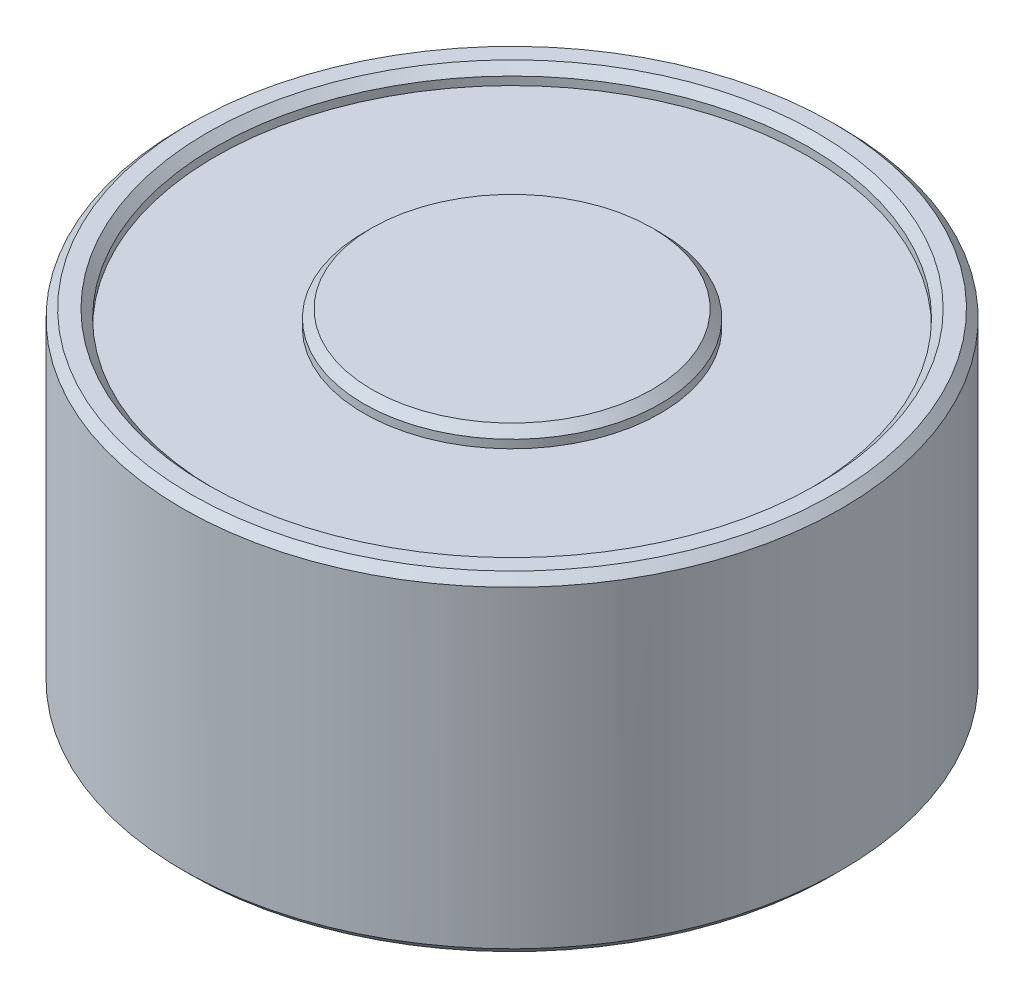
ISO-10303-21;
HEADER;
FILE_DESCRIPTION(('STEP AP214'),'2;1');
FILE_NAME('part.step','',(''),(''),'','','');
FILE_SCHEMA(('AUTOMOTIVE_DESIGN { 1 0 10303 214 1 1 1 1 }'));
ENDSEC;
DATA;
#1=APPLICATION_CONTEXT('core data for automotive mechanical design processes');
#2=APPLICATION_PROTOCOL_DEFINITION('international standard','automotive_design',2000,#1);
#3=PRODUCT_CONTEXT('',#1,'mechanical');
#4=PRODUCT('Part','Part','',(#3));
#5=PRODUCT_RELATED_PRODUCT_CATEGORY('part','',(#4));
#6=PRODUCT_DEFINITION_FORMATION('','',#4);
#7=PRODUCT_DEFINITION_CONTEXT('part definition',#1,'design');
#8=PRODUCT_DEFINITION('design','',#6,#7);
#9=PRODUCT_DEFINITION_SHAPE('','',#8);
#10=(LENGTH_UNIT() NAMED_UNIT(*) SI_UNIT(.MILLI.,.METRE.));
#11=(NAMED_UNIT(*) PLANE_ANGLE_UNIT() SI_UNIT($,.RADIAN.));
#12=(NAMED_UNIT(*) SI_UNIT($,.STERADIAN.) SOLID_ANGLE_UNIT());
#13=UNCERTAINTY_MEASURE_WITH_UNIT(LENGTH_MEASURE(1.E-05),#10,'distance_accuracy_value','');
#14=(GEOMETRIC_REPRESENTATION_CONTEXT(3) GLOBAL_UNCERTAINTY_ASSIGNED_CONTEXT((#13)) GLOBAL_UNIT_ASSIGNED_CONTEXT((#10,
#11,#12)) REPRESENTATION_CONTEXT('',''));
#15=CARTESIAN_POINT('',(0.,0.,0.));
#16=DIRECTION('',(0.,0.,1.));
#17=DIRECTION('',(1.,0.,0.));
#18=AXIS2_PLACEMENT_3D('',#15,#16,#17);
#19=CARTESIAN_POINT('',(0.,0.,0.));
#20=DIRECTION('',(0.,-1.,0.));
#21=DIRECTION('',(0.,0.,-1.));
#22=AXIS2_PLACEMENT_3D('',#19,#20,#21);
#23=PLANE('',#22);
#24=CARTESIAN_POINT('',(0.,0.,0.));
#25=DIRECTION('',(0.,-1.,0.));
#26=DIRECTION('',(0.,0.,-1.));
#27=AXIS2_PLACEMENT_3D('',#24,#25,#26);
#28=CIRCLE('',#27,2.525);
#29=CARTESIAN_POINT('',(0.,0.,-2.525));
#30=VERTEX_POINT('',#29);
#31=EDGE_CURVE('E68',#30,#30,#28,.T.);
#32=ORIENTED_EDGE('',*,*,#31,.F.);
#33=EDGE_LOOP('',(#32));
#34=FACE_BOUND('',#33,.T.);
#35=CARTESIAN_POINT('',(0.,0.,0.));
#36=DIRECTION('',(0.,-1.,0.));
#37=DIRECTION('',(0.,0.,-1.));
#38=AXIS2_PLACEMENT_3D('',#35,#36,#37);
#39=CIRCLE('',#38,19.5);
#40=CARTESIAN_POINT('',(0.,0.,-19.5));
#41=VERTEX_POINT('',#40);
#42=EDGE_CURVE('E74',#41,#41,#39,.T.);
#43=ORIENTED_EDGE('',*,*,#42,.T.);
#44=EDGE_LOOP('',(#43));
#45=FACE_BOUND('',#44,.T.);
#46=ADVANCED_FACE('F41',(#34,#45),#23,.T.);
#47=CARTESIAN_POINT('',(0.,0.,0.));
#48=DIRECTION('',(0.,-1.,0.));
#49=DIRECTION('',(0.,0.,-1.));
#50=AXIS2_PLACEMENT_3D('',#47,#48,#49);
#51=CYLINDRICAL_SURFACE('',#50,20.);
#52=CARTESIAN_POINT('',(0.,0.500000000000011,0.));
#53=DIRECTION('',(0.,-1.,0.));
#54=DIRECTION('',(0.,0.,-1.));
#55=AXIS2_PLACEMENT_3D('',#52,#53,#54);
#56=CIRCLE('',#55,20.);
#57=CARTESIAN_POINT('',(0.,0.500000000000011,-20.));
#58=VERTEX_POINT('',#57);
#59=EDGE_CURVE('E80',#58,#58,#56,.F.);
#60=ORIENTED_EDGE('',*,*,#59,.T.);
#61=EDGE_LOOP('',(#60));
#62=FACE_BOUND('',#61,.T.);
#63=CARTESIAN_POINT('',(0.,19.5,0.));
#64=DIRECTION('',(0.,1.,0.));
#65=DIRECTION('',(0.,0.,1.));
#66=AXIS2_PLACEMENT_3D('',#63,#64,#65);
#67=CIRCLE('',#66,20.);
#68=CARTESIAN_POINT('',(0.,19.5,20.));
#69=VERTEX_POINT('',#68);
#70=EDGE_CURVE('E77',#69,#69,#67,.F.);
#71=ORIENTED_EDGE('',*,*,#70,.T.);
#72=EDGE_LOOP('',(#71));
#73=FACE_BOUND('',#72,.T.);
#74=ADVANCED_FACE('F107',(#62,#73),#51,.T.);
#75=CARTESIAN_POINT('',(0.,20.,-20.));
#76=DIRECTION('',(0.,1.,0.));
#77=DIRECTION('',(0.,0.,1.));
#78=AXIS2_PLACEMENT_3D('',#75,#76,#77);
#79=PLANE('',#78);
#80=CARTESIAN_POINT('',(0.,20.,0.));
#81=DIRECTION('',(0.,1.,0.));
#82=DIRECTION('',(0.,0.,1.));
#83=AXIS2_PLACEMENT_3D('',#80,#81,#82);
#84=CIRCLE('',#83,19.5);
#85=CARTESIAN_POINT('',(0.,20.,19.5));
#86=VERTEX_POINT('',#85);
#87=EDGE_CURVE('E86',#86,#86,#84,.T.);
#88=ORIENTED_EDGE('',*,*,#87,.T.);
#89=EDGE_LOOP('',(#88));
#90=FACE_BOUND('',#89,.T.);
#91=CARTESIAN_POINT('',(0.,20.,0.));
#92=DIRECTION('',(0.,1.,0.));
#93=DIRECTION('',(0.,0.,1.));
#94=AXIS2_PLACEMENT_3D('',#91,#92,#93);
#95=CIRCLE('',#94,18.5);
#96=CARTESIAN_POINT('',(0.,20.,18.5));
#97=VERTEX_POINT('',#96);
#98=EDGE_CURVE('E83',#97,#97,#95,.F.);
#99=ORIENTED_EDGE('',*,*,#98,.T.);
#100=EDGE_LOOP('',(#99));
#101=FACE_BOUND('',#100,.T.);
#102=ADVANCED_FACE('F113',(#90,#101),#79,.T.);
#103=CARTESIAN_POINT('',(0.,0.,0.));
#104=DIRECTION('',(0.,-1.,0.));
#105=DIRECTION('',(0.,0.,-1.));
#106=AXIS2_PLACEMENT_3D('',#103,#104,#105);
#107=CYLINDRICAL_SURFACE('',#106,18.);
#108=CARTESIAN_POINT('',(0.,19.5,0.));
#109=DIRECTION('',(0.,1.,0.));
#110=DIRECTION('',(0.,0.,1.));
#111=AXIS2_PLACEMENT_3D('',#108,#109,#110);
#112=CIRCLE('',#111,18.);
#113=CARTESIAN_POINT('',(0.,19.5,18.));
#114=VERTEX_POINT('',#113);
#115=EDGE_CURVE('E89',#114,#114,#112,.T.);
#116=ORIENTED_EDGE('',*,*,#115,.T.);
#117=EDGE_LOOP('',(#116));
#118=FACE_BOUND('',#117,.T.);
#119=CARTESIAN_POINT('',(0.,19.,0.));
#120=DIRECTION('',(0.,-1.,0.));
#121=DIRECTION('',(0.,0.,-1.));
#122=AXIS2_PLACEMENT_3D('',#119,#120,#121);
#123=CIRCLE('',#122,18.);
#124=CARTESIAN_POINT('',(0.,19.,-18.));
#125=VERTEX_POINT('',#124);
#126=EDGE_CURVE('E65',#125,#125,#123,.T.);
#127=ORIENTED_EDGE('',*,*,#126,.T.);
#128=EDGE_LOOP('',(#127));
#129=FACE_BOUND('',#128,.T.);
#130=ADVANCED_FACE('F147',(#118,#129),#107,.F.);
#131=CARTESIAN_POINT('',(0.,19.,-18.));
#132=DIRECTION('',(0.,1.,0.));
#133=DIRECTION('',(0.,0.,1.));
#134=AXIS2_PLACEMENT_3D('',#131,#132,#133);
#135=PLANE('',#134);
#136=CARTESIAN_POINT('',(0.,19.,0.));
#137=DIRECTION('',(0.,-1.,0.));
#138=DIRECTION('',(0.,0.,-1.));
#139=AXIS2_PLACEMENT_3D('',#136,#137,#138);
#140=CIRCLE('',#139,9.);
#141=CARTESIAN_POINT('',(0.,19.,-9.));
#142=VERTEX_POINT('',#141);
#143=EDGE_CURVE('E61',#142,#142,#140,.T.);
#144=ORIENTED_EDGE('',*,*,#143,.T.);
#145=EDGE_LOOP('',(#144));
#146=FACE_BOUND('',#145,.T.);
#147=ORIENTED_EDGE('',*,*,#126,.F.);
#148=EDGE_LOOP('',(#147));
#149=FACE_BOUND('',#148,.T.);
#150=ADVANCED_FACE('F153',(#146,#149),#135,.T.);
#151=CARTESIAN_POINT('',(0.,0.,0.));
#152=DIRECTION('',(0.,-1.,0.));
#153=DIRECTION('',(0.,0.,-1.));
#154=AXIS2_PLACEMENT_3D('',#151,#152,#153);
#155=CYLINDRICAL_SURFACE('',#154,9.);
#156=CARTESIAN_POINT('',(0.,19.5,0.));
#157=DIRECTION('',(0.,1.,0.));
#158=DIRECTION('',(0.,0.,1.));
#159=AXIS2_PLACEMENT_3D('',#156,#157,#158);
#160=CIRCLE('',#159,9.);
#161=CARTESIAN_POINT('',(0.,19.5,9.));
#162=VERTEX_POINT('',#161);
#163=EDGE_CURVE('E49',#162,#162,#160,.F.);
#164=ORIENTED_EDGE('',*,*,#163,.T.);
#165=EDGE_LOOP('',(#164));
#166=FACE_BOUND('',#165,.T.);
#167=ORIENTED_EDGE('',*,*,#143,.F.);
#168=EDGE_LOOP('',(#167));
#169=FACE_BOUND('',#168,.T.);
#170=ADVANCED_FACE('F94',(#166,#169),#155,.T.);
#171=CARTESIAN_POINT('',(0.,20.,-9.));
#172=DIRECTION('',(0.,1.,0.));
#173=DIRECTION('',(0.,0.,1.));
#174=AXIS2_PLACEMENT_3D('',#171,#172,#173);
#175=PLANE('',#174);
#176=CARTESIAN_POINT('',(0.,20.,0.));
#177=DIRECTION('',(0.,1.,0.));
#178=DIRECTION('',(0.,0.,1.));
#179=AXIS2_PLACEMENT_3D('',#176,#177,#178);
#180=CIRCLE('',#179,8.5);
#181=CARTESIAN_POINT('',(0.,20.,8.5));
#182=VERTEX_POINT('',#181);
#183=EDGE_CURVE('E11',#182,#182,#180,.T.);
#184=ORIENTED_EDGE('',*,*,#183,.T.);
#185=EDGE_LOOP('',(#184));
#186=FACE_BOUND('',#185,.T.);
#187=ADVANCED_FACE('F127',(#186),#175,.T.);
#188=CARTESIAN_POINT('',(0.,0.,0.));
#189=DIRECTION('',(0.,1.,0.));
#190=DIRECTION('',(0.,0.,1.));
#191=AXIS2_PLACEMENT_3D('',#188,#189,#190);
#192=CONICAL_SURFACE('',#191,19.5,0.785398163397441);
#193=ORIENTED_EDGE('',*,*,#59,.F.);
#194=EDGE_LOOP('',(#193));
#195=FACE_BOUND('',#194,.T.);
#196=ORIENTED_EDGE('',*,*,#42,.F.);
#197=EDGE_LOOP('',(#196));
#198=FACE_BOUND('',#197,.T.);
#199=ADVANCED_FACE('F121',(#195,#198),#192,.T.);
#200=CARTESIAN_POINT('',(0.,19.5,0.));
#201=DIRECTION('',(0.,-1.,0.));
#202=DIRECTION('',(0.,0.,-1.));
#203=AXIS2_PLACEMENT_3D('',#200,#201,#202);
#204=CONICAL_SURFACE('',#203,20.,0.785398163397448);
#205=ORIENTED_EDGE('',*,*,#87,.F.);
#206=EDGE_LOOP('',(#205));
#207=FACE_BOUND('',#206,.T.);
#208=ORIENTED_EDGE('',*,*,#70,.F.);
#209=EDGE_LOOP('',(#208));
#210=FACE_BOUND('',#209,.T.);
#211=ADVANCED_FACE('F103',(#207,#210),#204,.T.);
#212=CARTESIAN_POINT('',(0.,20.,0.));
#213=DIRECTION('',(0.,1.,0.));
#214=DIRECTION('',(0.,0.,1.));
#215=AXIS2_PLACEMENT_3D('',#212,#213,#214);
#216=CONICAL_SURFACE('',#215,18.5,0.785398163397445);
#217=ORIENTED_EDGE('',*,*,#115,.F.);
#218=EDGE_LOOP('',(#217));
#219=FACE_BOUND('',#218,.T.);
#220=ORIENTED_EDGE('',*,*,#98,.F.);
#221=EDGE_LOOP('',(#220));
#222=FACE_BOUND('',#221,.T.);
#223=ADVANCED_FACE('F98',(#219,#222),#216,.F.);
#224=CARTESIAN_POINT('',(0.,19.5,0.));
#225=DIRECTION('',(0.,-1.,0.));
#226=DIRECTION('',(0.,0.,-1.));
#227=AXIS2_PLACEMENT_3D('',#224,#225,#226);
#228=CONICAL_SURFACE('',#227,9.,0.785398163397447);
#229=ORIENTED_EDGE('',*,*,#183,.F.);
#230=EDGE_LOOP('',(#229));
#231=FACE_BOUND('',#230,.T.);
#232=ORIENTED_EDGE('',*,*,#163,.F.);
#233=EDGE_LOOP('',(#232));
#234=FACE_BOUND('',#233,.T.);
#235=ADVANCED_FACE('F44',(#231,#234),#228,.T.);
#236=CARTESIAN_POINT('',(0.,13.1381927000421,0.));
#237=DIRECTION('',(0.,-1.,0.));
#238=DIRECTION('',(0.,0.,-1.));
#239=AXIS2_PLACEMENT_3D('',#236,#237,#238);
#240=CONICAL_SURFACE('',#239,2.1,1.02974425867665);
#241=CARTESIAN_POINT('',(0.,14.4,0.));
#242=VERTEX_POINT('',#241);
#243=VERTEX_LOOP('',#242);
#244=FACE_BOUND('',#243,.T.);
#245=CARTESIAN_POINT('',(0.,13.1381927000421,0.));
#246=DIRECTION('',(0.,-1.,0.));
#247=DIRECTION('',(0.,0.,-1.));
#248=AXIS2_PLACEMENT_3D('',#245,#246,#247);
#249=CIRCLE('',#248,2.1);
#250=CARTESIAN_POINT('',(0.,13.1381927000421,-2.1));
#251=VERTEX_POINT('',#250);
#252=EDGE_CURVE('E59',#251,#251,#249,.T.);
#253=ORIENTED_EDGE('',*,*,#252,.T.);
#254=EDGE_LOOP('',(#253));
#255=FACE_BOUND('',#254,.T.);
#256=ADVANCED_FACE('F52',(#244,#255),#240,.F.);
#257=CARTESIAN_POINT('',(0.,0.,0.));
#258=DIRECTION('',(0.,-1.,0.));
#259=DIRECTION('',(0.,0.,-1.));
#260=AXIS2_PLACEMENT_3D('',#257,#258,#259);
#261=CYLINDRICAL_SURFACE('',#260,2.1);
#262=ORIENTED_EDGE('',*,*,#252,.F.);
#263=EDGE_LOOP('',(#262));
#264=FACE_BOUND('',#263,.T.);
#265=CARTESIAN_POINT('',(0.,0.425000000000002,0.));
#266=DIRECTION('',(0.,-1.,0.));
#267=DIRECTION('',(0.,0.,-1.));
#268=AXIS2_PLACEMENT_3D('',#265,#266,#267);
#269=CIRCLE('',#268,2.1);
#270=CARTESIAN_POINT('',(0.,0.425000000000002,-2.1));
#271=VERTEX_POINT('',#270);
#272=EDGE_CURVE('E62',#271,#271,#269,.T.);
#273=ORIENTED_EDGE('',*,*,#272,.T.);
#274=EDGE_LOOP('',(#273));
#275=FACE_BOUND('',#274,.T.);
#276=ADVANCED_FACE('F55',(#264,#275),#261,.F.);
#277=CARTESIAN_POINT('',(0.,0.,0.));
#278=DIRECTION('',(0.,-1.,0.));
#279=DIRECTION('',(0.,0.,-1.));
#280=AXIS2_PLACEMENT_3D('',#277,#278,#279);
#281=CONICAL_SURFACE('',#280,2.525,0.785398163397445);
#282=ORIENTED_EDGE('',*,*,#272,.F.);
#283=EDGE_LOOP('',(#282));
#284=FACE_BOUND('',#283,.T.);
#285=ORIENTED_EDGE('',*,*,#31,.T.);
#286=EDGE_LOOP('',(#285));
#287=FACE_BOUND('',#286,.T.);
#288=ADVANCED_FACE('F167',(#284,#287),#281,.F.);
#289=CLOSED_SHELL('',(#46,#74,#102,#130,#150,#170,#187,#199,#211,#223,#235,#256,#276,#288));
#290=MANIFOLD_SOLID_BREP('B2',#289);
#291=ADVANCED_BREP_SHAPE_REPRESENTATION('',(#18,#290),#14);
#292=SHAPE_DEFINITION_REPRESENTATION(#9,#291);
ENDSEC;
END-ISO-10303-21;
